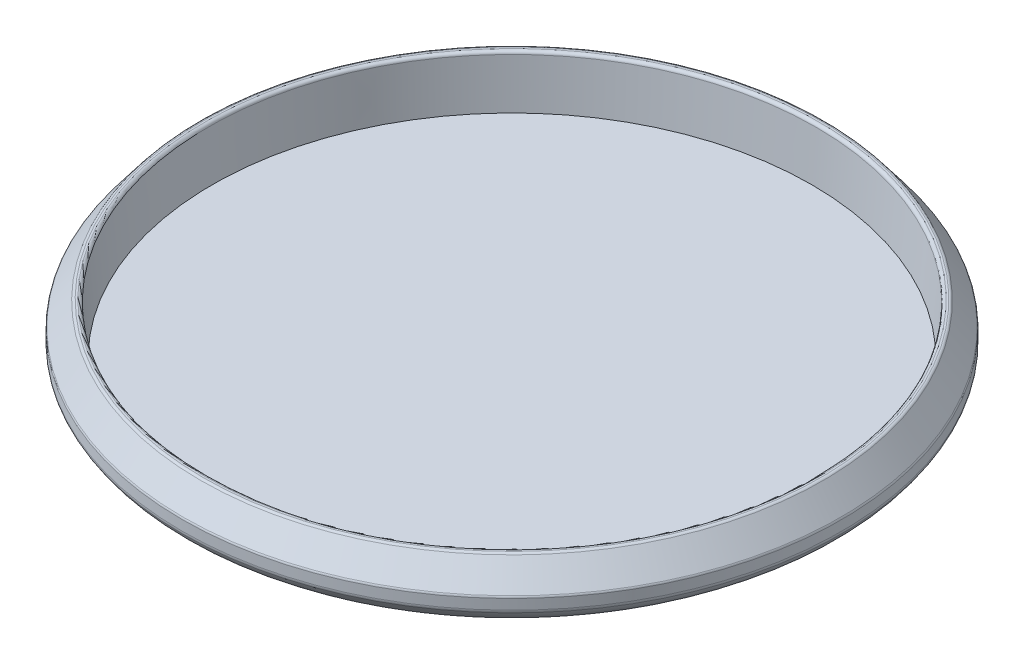
ISO-10303-21;
HEADER;
FILE_DESCRIPTION(('STEP AP214'),'2;1');
FILE_NAME('part.step','',(''),(''),'','','');
FILE_SCHEMA(('AUTOMOTIVE_DESIGN { 1 0 10303 214 1 1 1 1 }'));
ENDSEC;
DATA;
#1=APPLICATION_CONTEXT('core data for automotive mechanical design processes');
#2=APPLICATION_PROTOCOL_DEFINITION('international standard','automotive_design',2000,#1);
#3=PRODUCT_CONTEXT('',#1,'mechanical');
#4=PRODUCT('Part','Part','',(#3));
#5=PRODUCT_RELATED_PRODUCT_CATEGORY('part','',(#4));
#6=PRODUCT_DEFINITION_FORMATION('','',#4);
#7=PRODUCT_DEFINITION_CONTEXT('part definition',#1,'design');
#8=PRODUCT_DEFINITION('design','',#6,#7);
#9=PRODUCT_DEFINITION_SHAPE('','',#8);
#10=(LENGTH_UNIT() NAMED_UNIT(*) SI_UNIT(.MILLI.,.METRE.));
#11=(NAMED_UNIT(*) PLANE_ANGLE_UNIT() SI_UNIT($,.RADIAN.));
#12=(NAMED_UNIT(*) SI_UNIT($,.STERADIAN.) SOLID_ANGLE_UNIT());
#13=UNCERTAINTY_MEASURE_WITH_UNIT(LENGTH_MEASURE(1.E-05),#10,'distance_accuracy_value','');
#14=(GEOMETRIC_REPRESENTATION_CONTEXT(3) GLOBAL_UNCERTAINTY_ASSIGNED_CONTEXT((#13)) GLOBAL_UNIT_ASSIGNED_CONTEXT((#10,
#11,#12)) REPRESENTATION_CONTEXT('',''));
#15=CARTESIAN_POINT('',(0.,0.,0.));
#16=DIRECTION('',(0.,0.,1.));
#17=DIRECTION('',(1.,0.,0.));
#18=AXIS2_PLACEMENT_3D('',#15,#16,#17);
#19=CARTESIAN_POINT('',(0.,1.5,0.));
#20=DIRECTION('',(0.,1.,0.));
#21=DIRECTION('',(0.,0.,1.));
#22=AXIS2_PLACEMENT_3D('',#19,#20,#21);
#23=PLANE('',#22);
#24=CARTESIAN_POINT('',(0.,1.5,0.));
#25=DIRECTION('',(0.,-1.,0.));
#26=DIRECTION('',(0.,0.,-1.));
#27=AXIS2_PLACEMENT_3D('',#24,#25,#26);
#28=CIRCLE('',#27,95.);
#29=CARTESIAN_POINT('',(0.,1.5,-95.));
#30=VERTEX_POINT('',#29);
#31=EDGE_CURVE('E81',#30,#30,#28,.T.);
#32=ORIENTED_EDGE('',*,*,#31,.F.);
#33=EDGE_LOOP('',(#32));
#34=FACE_BOUND('',#33,.T.);
#35=ADVANCED_FACE('F37',(#34),#23,.T.);
#36=CARTESIAN_POINT('',(0.,9.51678039252937,0.));
#37=DIRECTION('',(0.,-1.,0.));
#38=DIRECTION('',(0.,0.,-1.));
#39=AXIS2_PLACEMENT_3D('',#36,#37,#38);
#40=TOROIDAL_SURFACE('',#39,95.7578090940791,9.54690440209288);
#41=CARTESIAN_POINT('',(0.,5.13071645101927,0.));
#42=DIRECTION('',(0.,1.,0.));
#43=DIRECTION('',(0.,0.,1.));
#44=AXIS2_PLACEMENT_3D('',#41,#42,#43);
#45=CIRCLE('',#44,104.237539441424);
#46=CARTESIAN_POINT('',(0.,5.13071645101927,104.237539441424));
#47=VERTEX_POINT('',#46);
#48=EDGE_CURVE('E45',#47,#47,#45,.F.);
#49=ORIENTED_EDGE('',*,*,#48,.T.);
#50=EDGE_LOOP('',(#49));
#51=FACE_BOUND('',#50,.T.);
#52=CARTESIAN_POINT('',(0.,0.,0.));
#53=DIRECTION('',(0.,1.,0.));
#54=DIRECTION('',(0.,0.,1.));
#55=AXIS2_PLACEMENT_3D('',#52,#53,#54);
#56=CIRCLE('',#55,95.);
#57=CARTESIAN_POINT('',(0.,0.,95.));
#58=VERTEX_POINT('',#57);
#59=EDGE_CURVE('E77',#58,#58,#56,.T.);
#60=ORIENTED_EDGE('',*,*,#59,.T.);
#61=EDGE_LOOP('',(#60));
#62=FACE_BOUND('',#61,.T.);
#63=ADVANCED_FACE('F89',(#51,#62),#40,.T.);
#64=CARTESIAN_POINT('',(0.,0.,0.));
#65=DIRECTION('',(0.,-1.,0.));
#66=DIRECTION('',(0.,0.,-1.));
#67=AXIS2_PLACEMENT_3D('',#64,#65,#66);
#68=CYLINDRICAL_SURFACE('',#67,104.461103857658);
#69=CARTESIAN_POINT('',(0.,6.04956171368853,0.));
#70=DIRECTION('',(0.,1.,0.));
#71=DIRECTION('',(0.,0.,1.));
#72=AXIS2_PLACEMENT_3D('',#69,#70,#71);
#73=CIRCLE('',#72,104.461103857658);
#74=CARTESIAN_POINT('',(0.,6.04956171368853,104.461103857658));
#75=VERTEX_POINT('',#74);
#76=EDGE_CURVE('E10',#75,#75,#73,.T.);
#77=ORIENTED_EDGE('',*,*,#76,.T.);
#78=EDGE_LOOP('',(#77));
#79=FACE_BOUND('',#78,.T.);
#80=CARTESIAN_POINT('',(0.,9.25570026220736,0.));
#81=DIRECTION('',(0.,1.,0.));
#82=DIRECTION('',(0.,0.,1.));
#83=AXIS2_PLACEMENT_3D('',#80,#81,#82);
#84=CIRCLE('',#83,104.461103857658);
#85=CARTESIAN_POINT('',(0.,9.25570026220736,104.461103857658));
#86=VERTEX_POINT('',#85);
#87=EDGE_CURVE('E55',#86,#86,#84,.F.);
#88=ORIENTED_EDGE('',*,*,#87,.T.);
#89=EDGE_LOOP('',(#88));
#90=FACE_BOUND('',#89,.T.);
#91=ADVANCED_FACE('F94',(#79,#90),#68,.T.);
#92=CARTESIAN_POINT('',(0.,9.5930011019782,0.));
#93=DIRECTION('',(0.,-1.,0.));
#94=DIRECTION('',(0.,0.,-1.));
#95=AXIS2_PLACEMENT_3D('',#92,#93,#94);
#96=CONICAL_SURFACE('',#95,104.461103857658,0.650634100044437);
#97=CARTESIAN_POINT('',(0.,9.86139134301403,0.));
#98=DIRECTION('',(0.,1.,0.));
#99=DIRECTION('',(0.,0.,1.));
#100=AXIS2_PLACEMENT_3D('',#97,#98,#99);
#101=CIRCLE('',#100,104.25680374746);
#102=CARTESIAN_POINT('',(0.,9.86139134301403,104.25680374746));
#103=VERTEX_POINT('',#102);
#104=EDGE_CURVE('E50',#103,#103,#101,.T.);
#105=ORIENTED_EDGE('',*,*,#104,.T.);
#106=EDGE_LOOP('',(#105));
#107=FACE_BOUND('',#106,.T.);
#108=CARTESIAN_POINT('',(0.,17.1556910808067,0.));
#109=DIRECTION('',(0.,1.,0.));
#110=DIRECTION('',(0.,0.,1.));
#111=AXIS2_PLACEMENT_3D('',#108,#109,#110);
#112=CIRCLE('',#111,98.7043431419799);
#113=CARTESIAN_POINT('',(0.,17.1556910808067,98.7043431419799));
#114=VERTEX_POINT('',#113);
#115=EDGE_CURVE('E61',#114,#114,#112,.F.);
#116=ORIENTED_EDGE('',*,*,#115,.T.);
#117=EDGE_LOOP('',(#116));
#118=FACE_BOUND('',#117,.T.);
#119=ADVANCED_FACE('F121',(#107,#118),#96,.T.);
#120=CARTESIAN_POINT('',(96.4041930495911,17.55,0.));
#121=DIRECTION('',(0.,1.,0.));
#122=DIRECTION('',(0.,0.,1.));
#123=AXIS2_PLACEMENT_3D('',#120,#121,#122);
#124=PLANE('',#123);
#125=CARTESIAN_POINT('',(0.,17.55,0.));
#126=DIRECTION('',(0.,1.,0.));
#127=DIRECTION('',(0.,0.,1.));
#128=AXIS2_PLACEMENT_3D('',#125,#126,#127);
#129=CIRCLE('',#128,97.3205242236085);
#130=CARTESIAN_POINT('',(0.,17.55,97.3205242236085));
#131=VERTEX_POINT('',#130);
#132=EDGE_CURVE('E69',#131,#131,#129,.F.);
#133=ORIENTED_EDGE('',*,*,#132,.T.);
#134=EDGE_LOOP('',(#133));
#135=FACE_BOUND('',#134,.T.);
#136=CARTESIAN_POINT('',(0.,17.55,0.));
#137=DIRECTION('',(0.,1.,0.));
#138=DIRECTION('',(0.,0.,1.));
#139=AXIS2_PLACEMENT_3D('',#136,#137,#138);
#140=CIRCLE('',#139,97.9086432521778);
#141=CARTESIAN_POINT('',(0.,17.55,97.9086432521778));
#142=VERTEX_POINT('',#141);
#143=EDGE_CURVE('E73',#142,#142,#140,.T.);
#144=ORIENTED_EDGE('',*,*,#143,.T.);
#145=EDGE_LOOP('',(#144));
#146=FACE_BOUND('',#145,.T.);
#147=ADVANCED_FACE('F125',(#135,#146),#124,.T.);
#148=CARTESIAN_POINT('',(0.,17.55,0.));
#149=DIRECTION('',(0.,1.,0.));
#150=DIRECTION('',(0.,0.,1.));
#151=AXIS2_PLACEMENT_3D('',#148,#149,#150);
#152=CONICAL_SURFACE('',#151,96.4041930495911,0.0872664625997164);
#153=CARTESIAN_POINT('',(0.,16.6371557427476,0.));
#154=DIRECTION('',(0.,-1.,0.));
#155=DIRECTION('',(0.,0.,-1.));
#156=AXIS2_PLACEMENT_3D('',#153,#154,#155);
#157=CIRCLE('',#156,96.3243295255168);
#158=CARTESIAN_POINT('',(0.,16.6371557427476,-96.3243295255168));
#159=VERTEX_POINT('',#158);
#160=EDGE_CURVE('E65',#159,#159,#157,.F.);
#161=ORIENTED_EDGE('',*,*,#160,.T.);
#162=EDGE_LOOP('',(#161));
#163=FACE_BOUND('',#162,.T.);
#164=ORIENTED_EDGE('',*,*,#31,.T.);
#165=EDGE_LOOP('',(#164));
#166=FACE_BOUND('',#165,.T.);
#167=ADVANCED_FACE('F86',(#163,#166),#152,.F.);
#168=CARTESIAN_POINT('',(0.,0.,0.));
#169=DIRECTION('',(0.,1.,0.));
#170=DIRECTION('',(0.,0.,1.));
#171=AXIS2_PLACEMENT_3D('',#168,#169,#170);
#172=PLANE('',#171);
#173=ORIENTED_EDGE('',*,*,#59,.F.);
#174=EDGE_LOOP('',(#173));
#175=FACE_BOUND('',#174,.T.);
#176=ADVANCED_FACE('F98',(#175),#172,.F.);
#177=CARTESIAN_POINT('',(0.,16.55,0.));
#178=DIRECTION('',(0.,1.,0.));
#179=DIRECTION('',(0.,0.,1.));
#180=AXIS2_PLACEMENT_3D('',#177,#178,#179);
#181=TOROIDAL_SURFACE('',#180,97.3205242236085,1.);
#182=ORIENTED_EDGE('',*,*,#160,.F.);
#183=EDGE_LOOP('',(#182));
#184=FACE_BOUND('',#183,.T.);
#185=ORIENTED_EDGE('',*,*,#132,.F.);
#186=EDGE_LOOP('',(#185));
#187=FACE_BOUND('',#186,.T.);
#188=ADVANCED_FACE('F101',(#184,#187),#181,.T.);
#189=CARTESIAN_POINT('',(0.,16.55,0.));
#190=DIRECTION('',(0.,1.,0.));
#191=DIRECTION('',(0.,0.,1.));
#192=AXIS2_PLACEMENT_3D('',#189,#190,#191);
#193=TOROIDAL_SURFACE('',#192,97.9086432521778,1.);
#194=ORIENTED_EDGE('',*,*,#143,.F.);
#195=EDGE_LOOP('',(#194));
#196=FACE_BOUND('',#195,.T.);
#197=ORIENTED_EDGE('',*,*,#115,.F.);
#198=EDGE_LOOP('',(#197));
#199=FACE_BOUND('',#198,.T.);
#200=ADVANCED_FACE('F105',(#196,#199),#193,.T.);
#201=CARTESIAN_POINT('',(0.,9.25570026220736,0.));
#202=DIRECTION('',(0.,1.,0.));
#203=DIRECTION('',(0.,0.,1.));
#204=AXIS2_PLACEMENT_3D('',#201,#202,#203);
#205=TOROIDAL_SURFACE('',#204,103.461103857658,1.);
#206=ORIENTED_EDGE('',*,*,#104,.F.);
#207=EDGE_LOOP('',(#206));
#208=FACE_BOUND('',#207,.T.);
#209=ORIENTED_EDGE('',*,*,#87,.F.);
#210=EDGE_LOOP('',(#209));
#211=FACE_BOUND('',#210,.T.);
#212=ADVANCED_FACE('F108',(#208,#211),#205,.T.);
#213=CARTESIAN_POINT('',(0.,6.04956171368853,0.));
#214=DIRECTION('',(0.,1.,0.));
#215=DIRECTION('',(0.,0.,1.));
#216=AXIS2_PLACEMENT_3D('',#213,#214,#215);
#217=TOROIDAL_SURFACE('',#216,102.461103857658,2.);
#218=ORIENTED_EDGE('',*,*,#76,.F.);
#219=EDGE_LOOP('',(#218));
#220=FACE_BOUND('',#219,.T.);
#221=ORIENTED_EDGE('',*,*,#48,.F.);
#222=EDGE_LOOP('',(#221));
#223=FACE_BOUND('',#222,.T.);
#224=ADVANCED_FACE('F39',(#220,#223),#217,.T.);
#225=CLOSED_SHELL('',(#35,#63,#91,#119,#147,#167,#176,#188,#200,#212,#224));
#226=MANIFOLD_SOLID_BREP('B2',#225);
#227=ADVANCED_BREP_SHAPE_REPRESENTATION('',(#18,#226),#14);
#228=SHAPE_DEFINITION_REPRESENTATION(#9,#227);
ENDSEC;
END-ISO-10303-21;
